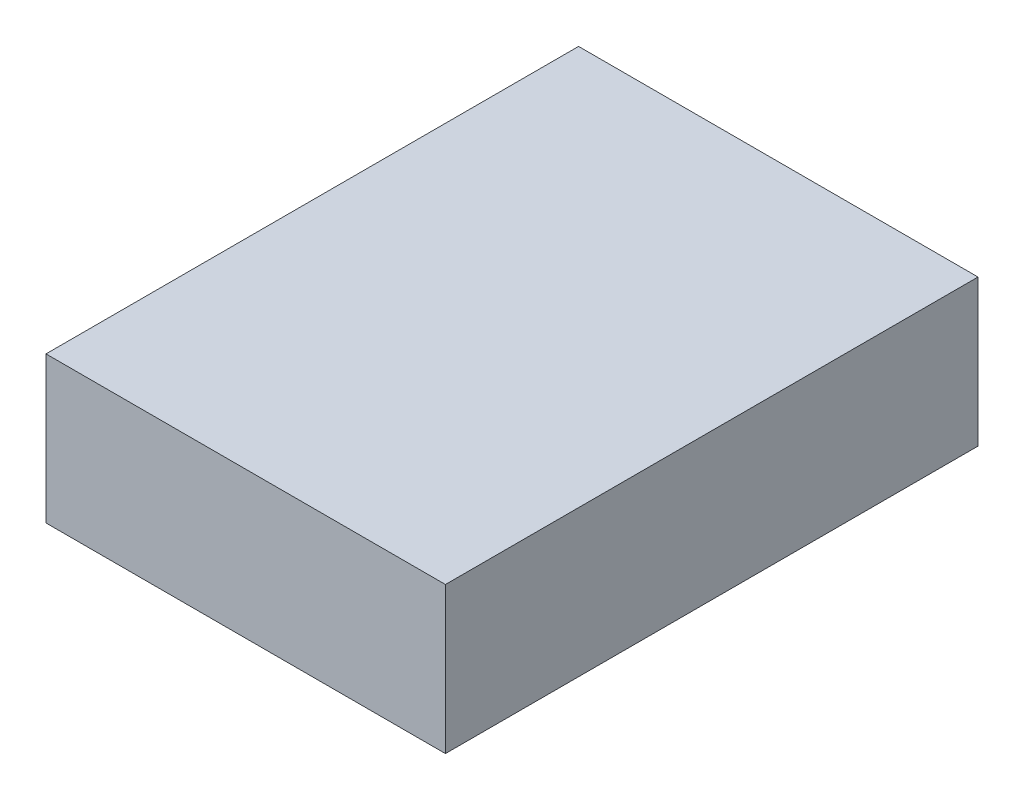
ISO-10303-21;
HEADER;
FILE_DESCRIPTION(('STEP AP214'),'2;1');
FILE_NAME('part.step','',(''),(''),'','','');
FILE_SCHEMA(('AUTOMOTIVE_DESIGN { 1 0 10303 214 1 1 1 1 }'));
ENDSEC;
DATA;
#1=APPLICATION_CONTEXT('core data for automotive mechanical design processes');
#2=APPLICATION_PROTOCOL_DEFINITION('international standard','automotive_design',2000,#1);
#3=PRODUCT_CONTEXT('',#1,'mechanical');
#4=PRODUCT('Part','Part','',(#3));
#5=PRODUCT_RELATED_PRODUCT_CATEGORY('part','',(#4));
#6=PRODUCT_DEFINITION_FORMATION('','',#4);
#7=PRODUCT_DEFINITION_CONTEXT('part definition',#1,'design');
#8=PRODUCT_DEFINITION('design','',#6,#7);
#9=PRODUCT_DEFINITION_SHAPE('','',#8);
#10=(LENGTH_UNIT() NAMED_UNIT(*) SI_UNIT(.MILLI.,.METRE.));
#11=(NAMED_UNIT(*) PLANE_ANGLE_UNIT() SI_UNIT($,.RADIAN.));
#12=(NAMED_UNIT(*) SI_UNIT($,.STERADIAN.) SOLID_ANGLE_UNIT());
#13=UNCERTAINTY_MEASURE_WITH_UNIT(LENGTH_MEASURE(1.E-05),#10,'distance_accuracy_value','');
#14=(GEOMETRIC_REPRESENTATION_CONTEXT(3) GLOBAL_UNCERTAINTY_ASSIGNED_CONTEXT((#13)) GLOBAL_UNIT_ASSIGNED_CONTEXT((#10,
#11,#12)) REPRESENTATION_CONTEXT('',''));
#15=CARTESIAN_POINT('',(0.,0.,0.));
#16=DIRECTION('',(0.,0.,1.));
#17=DIRECTION('',(1.,0.,0.));
#18=AXIS2_PLACEMENT_3D('',#15,#16,#17);
#19=CARTESIAN_POINT('',(0.,22.,0.));
#20=DIRECTION('',(1.,0.,0.));
#21=DIRECTION('',(0.,0.,-1.));
#22=AXIS2_PLACEMENT_3D('',#19,#20,#21);
#23=PLANE('',#22);
#24=DIRECTION('',(0.,0.,1.));
#25=VECTOR('',#24,1.);
#26=CARTESIAN_POINT('',(0.,0.,0.));
#27=LINE('',#26,#25);
#28=CARTESIAN_POINT('',(0.,0.,0.));
#29=VERTEX_POINT('',#28);
#30=CARTESIAN_POINT('',(0.,0.,80.));
#31=VERTEX_POINT('',#30);
#32=EDGE_CURVE('E107',#29,#31,#27,.T.);
#33=ORIENTED_EDGE('',*,*,#32,.T.);
#34=DIRECTION('',(0.,-1.,0.));
#35=VECTOR('',#34,1.);
#36=CARTESIAN_POINT('',(0.,22.,80.));
#37=LINE('',#36,#35);
#38=CARTESIAN_POINT('',(0.,22.,80.));
#39=VERTEX_POINT('',#38);
#40=EDGE_CURVE('E11',#39,#31,#37,.T.);
#41=ORIENTED_EDGE('',*,*,#40,.F.);
#42=DIRECTION('',(0.,0.,1.));
#43=VECTOR('',#42,1.);
#44=CARTESIAN_POINT('',(0.,22.,0.));
#45=LINE('',#44,#43);
#46=CARTESIAN_POINT('',(0.,22.,0.));
#47=VERTEX_POINT('',#46);
#48=EDGE_CURVE('E91',#47,#39,#45,.T.);
#49=ORIENTED_EDGE('',*,*,#48,.F.);
#50=DIRECTION('',(0.,-1.,0.));
#51=VECTOR('',#50,1.);
#52=CARTESIAN_POINT('',(0.,22.,0.));
#53=LINE('',#52,#51);
#54=EDGE_CURVE('E103',#47,#29,#53,.T.);
#55=ORIENTED_EDGE('',*,*,#54,.T.);
#56=EDGE_LOOP('',(#33,#41,#49,#55));
#57=FACE_BOUND('',#56,.T.);
#58=ADVANCED_FACE('F39',(#57),#23,.F.);
#59=CARTESIAN_POINT('',(0.,22.,80.));
#60=DIRECTION('',(0.,0.,-1.));
#61=DIRECTION('',(-1.,0.,0.));
#62=AXIS2_PLACEMENT_3D('',#59,#60,#61);
#63=PLANE('',#62);
#64=DIRECTION('',(1.,0.,0.));
#65=VECTOR('',#64,1.);
#66=CARTESIAN_POINT('',(0.,0.,80.));
#67=LINE('',#66,#65);
#68=CARTESIAN_POINT('',(60.,0.,80.));
#69=VERTEX_POINT('',#68);
#70=EDGE_CURVE('E96',#31,#69,#67,.T.);
#71=ORIENTED_EDGE('',*,*,#70,.T.);
#72=DIRECTION('',(0.,-1.,0.));
#73=VECTOR('',#72,1.);
#74=CARTESIAN_POINT('',(60.,22.,80.));
#75=LINE('',#74,#73);
#76=CARTESIAN_POINT('',(60.,22.,80.));
#77=VERTEX_POINT('',#76);
#78=EDGE_CURVE('E48',#77,#69,#75,.T.);
#79=ORIENTED_EDGE('',*,*,#78,.F.);
#80=DIRECTION('',(1.,0.,0.));
#81=VECTOR('',#80,1.);
#82=CARTESIAN_POINT('',(0.,22.,80.));
#83=LINE('',#82,#81);
#84=EDGE_CURVE('E86',#39,#77,#83,.T.);
#85=ORIENTED_EDGE('',*,*,#84,.F.);
#86=ORIENTED_EDGE('',*,*,#40,.T.);
#87=EDGE_LOOP('',(#71,#79,#85,#86));
#88=FACE_BOUND('',#87,.T.);
#89=ADVANCED_FACE('F95',(#88),#63,.F.);
#90=CARTESIAN_POINT('',(60.,22.,0.));
#91=DIRECTION('',(-1.,0.,0.));
#92=DIRECTION('',(0.,0.,1.));
#93=AXIS2_PLACEMENT_3D('',#90,#91,#92);
#94=PLANE('',#93);
#95=DIRECTION('',(0.,0.,-1.));
#96=VECTOR('',#95,1.);
#97=CARTESIAN_POINT('',(60.,0.,0.));
#98=LINE('',#97,#96);
#99=CARTESIAN_POINT('',(60.,0.,0.));
#100=VERTEX_POINT('',#99);
#101=EDGE_CURVE('E73',#69,#100,#98,.T.);
#102=ORIENTED_EDGE('',*,*,#101,.T.);
#103=DIRECTION('',(0.,-1.,0.));
#104=VECTOR('',#103,1.);
#105=CARTESIAN_POINT('',(60.,22.,0.));
#106=LINE('',#105,#104);
#107=CARTESIAN_POINT('',(60.,22.,0.));
#108=VERTEX_POINT('',#107);
#109=EDGE_CURVE('E98',#108,#100,#106,.T.);
#110=ORIENTED_EDGE('',*,*,#109,.F.);
#111=DIRECTION('',(0.,0.,-1.));
#112=VECTOR('',#111,1.);
#113=CARTESIAN_POINT('',(60.,22.,0.));
#114=LINE('',#113,#112);
#115=EDGE_CURVE('E89',#77,#108,#114,.T.);
#116=ORIENTED_EDGE('',*,*,#115,.F.);
#117=ORIENTED_EDGE('',*,*,#78,.T.);
#118=EDGE_LOOP('',(#102,#110,#116,#117));
#119=FACE_BOUND('',#118,.T.);
#120=ADVANCED_FACE('F99',(#119),#94,.F.);
#121=CARTESIAN_POINT('',(0.,22.,0.));
#122=DIRECTION('',(0.,0.,1.));
#123=DIRECTION('',(1.,0.,0.));
#124=AXIS2_PLACEMENT_3D('',#121,#122,#123);
#125=PLANE('',#124);
#126=DIRECTION('',(-1.,0.,0.));
#127=VECTOR('',#126,1.);
#128=CARTESIAN_POINT('',(0.,0.,0.));
#129=LINE('',#128,#127);
#130=EDGE_CURVE('E79',#100,#29,#129,.T.);
#131=ORIENTED_EDGE('',*,*,#130,.T.);
#132=ORIENTED_EDGE('',*,*,#54,.F.);
#133=DIRECTION('',(-1.,0.,0.));
#134=VECTOR('',#133,1.);
#135=CARTESIAN_POINT('',(0.,22.,0.));
#136=LINE('',#135,#134);
#137=EDGE_CURVE('E56',#108,#47,#136,.T.);
#138=ORIENTED_EDGE('',*,*,#137,.F.);
#139=ORIENTED_EDGE('',*,*,#109,.T.);
#140=EDGE_LOOP('',(#131,#132,#138,#139));
#141=FACE_BOUND('',#140,.T.);
#142=ADVANCED_FACE('F120',(#141),#125,.F.);
#143=CARTESIAN_POINT('',(0.,22.,0.));
#144=DIRECTION('',(0.,1.,0.));
#145=DIRECTION('',(0.,0.,1.));
#146=AXIS2_PLACEMENT_3D('',#143,#144,#145);
#147=PLANE('',#146);
#148=ORIENTED_EDGE('',*,*,#48,.T.);
#149=ORIENTED_EDGE('',*,*,#84,.T.);
#150=ORIENTED_EDGE('',*,*,#115,.T.);
#151=ORIENTED_EDGE('',*,*,#137,.T.);
#152=EDGE_LOOP('',(#148,#149,#150,#151));
#153=FACE_BOUND('',#152,.T.);
#154=ADVANCED_FACE('F87',(#153),#147,.T.);
#155=CARTESIAN_POINT('',(0.,0.,0.));
#156=DIRECTION('',(0.,1.,0.));
#157=DIRECTION('',(0.,0.,1.));
#158=AXIS2_PLACEMENT_3D('',#155,#156,#157);
#159=PLANE('',#158);
#160=ORIENTED_EDGE('',*,*,#32,.F.);
#161=ORIENTED_EDGE('',*,*,#130,.F.);
#162=ORIENTED_EDGE('',*,*,#101,.F.);
#163=ORIENTED_EDGE('',*,*,#70,.F.);
#164=EDGE_LOOP('',(#160,#161,#162,#163));
#165=FACE_BOUND('',#164,.T.);
#166=ADVANCED_FACE('F123',(#165),#159,.F.);
#167=CLOSED_SHELL('',(#58,#89,#120,#142,#154,#166));
#168=MANIFOLD_SOLID_BREP('B2',#167);
#169=ADVANCED_BREP_SHAPE_REPRESENTATION('',(#18,#168),#14);
#170=SHAPE_DEFINITION_REPRESENTATION(#9,#169);
ENDSEC;
END-ISO-10303-21;
